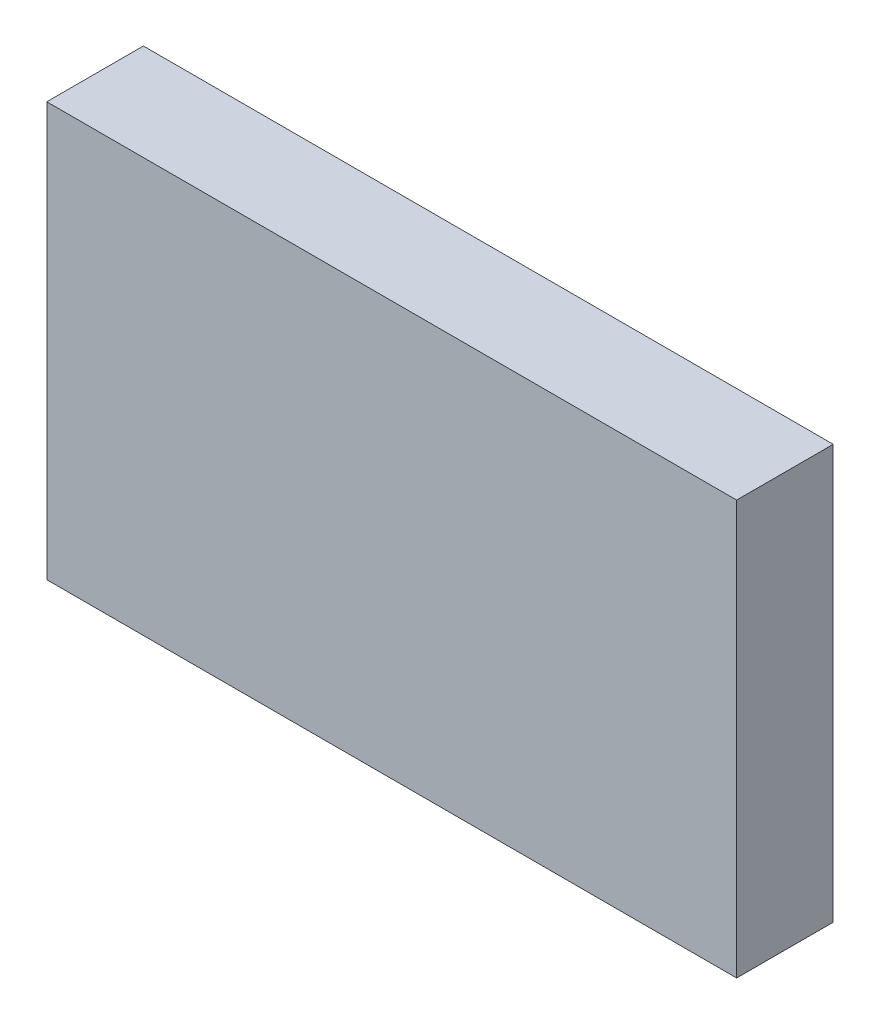
ISO-10303-21;
HEADER;
FILE_DESCRIPTION(('STEP AP214'),'2;1');
FILE_NAME('part.step','',(''),(''),'','','');
FILE_SCHEMA(('AUTOMOTIVE_DESIGN { 1 0 10303 214 1 1 1 1 }'));
ENDSEC;
DATA;
#1=APPLICATION_CONTEXT('core data for automotive mechanical design processes');
#2=APPLICATION_PROTOCOL_DEFINITION('international standard','automotive_design',2000,#1);
#3=PRODUCT_CONTEXT('',#1,'mechanical');
#4=PRODUCT('Part','Part','',(#3));
#5=PRODUCT_RELATED_PRODUCT_CATEGORY('part','',(#4));
#6=PRODUCT_DEFINITION_FORMATION('','',#4);
#7=PRODUCT_DEFINITION_CONTEXT('part definition',#1,'design');
#8=PRODUCT_DEFINITION('design','',#6,#7);
#9=PRODUCT_DEFINITION_SHAPE('','',#8);
#10=(LENGTH_UNIT() NAMED_UNIT(*) SI_UNIT(.MILLI.,.METRE.));
#11=(NAMED_UNIT(*) PLANE_ANGLE_UNIT() SI_UNIT($,.RADIAN.));
#12=(NAMED_UNIT(*) SI_UNIT($,.STERADIAN.) SOLID_ANGLE_UNIT());
#13=UNCERTAINTY_MEASURE_WITH_UNIT(LENGTH_MEASURE(1.E-05),#10,'distance_accuracy_value','');
#14=(GEOMETRIC_REPRESENTATION_CONTEXT(3) GLOBAL_UNCERTAINTY_ASSIGNED_CONTEXT((#13)) GLOBAL_UNIT_ASSIGNED_CONTEXT((#10,
#11,#12)) REPRESENTATION_CONTEXT('',''));
#15=CARTESIAN_POINT('',(0.,0.,0.));
#16=DIRECTION('',(0.,0.,1.));
#17=DIRECTION('',(1.,0.,0.));
#18=AXIS2_PLACEMENT_3D('',#15,#16,#17);
#19=CARTESIAN_POINT('',(25.,15.,3.5));
#20=DIRECTION('',(-1.,0.,0.));
#21=DIRECTION('',(0.,-1.,0.));
#22=AXIS2_PLACEMENT_3D('',#19,#20,#21);
#23=PLANE('',#22);
#24=DIRECTION('',(0.,1.,0.));
#25=VECTOR('',#24,1.);
#26=CARTESIAN_POINT('',(25.,15.,-3.5));
#27=LINE('',#26,#25);
#28=CARTESIAN_POINT('',(25.,-15.,-3.5));
#29=VERTEX_POINT('',#28);
#30=CARTESIAN_POINT('',(25.,15.,-3.5));
#31=VERTEX_POINT('',#30);
#32=EDGE_CURVE('E96',#29,#31,#27,.T.);
#33=ORIENTED_EDGE('',*,*,#32,.T.);
#34=DIRECTION('',(0.,0.,-1.));
#35=VECTOR('',#34,1.);
#36=CARTESIAN_POINT('',(25.,15.,3.5));
#37=LINE('',#36,#35);
#38=CARTESIAN_POINT('',(25.,15.,3.5));
#39=VERTEX_POINT('',#38);
#40=EDGE_CURVE('E11',#39,#31,#37,.T.);
#41=ORIENTED_EDGE('',*,*,#40,.F.);
#42=DIRECTION('',(0.,1.,0.));
#43=VECTOR('',#42,1.);
#44=CARTESIAN_POINT('',(25.,15.,3.5));
#45=LINE('',#44,#43);
#46=CARTESIAN_POINT('',(25.,-15.,3.5));
#47=VERTEX_POINT('',#46);
#48=EDGE_CURVE('E84',#47,#39,#45,.T.);
#49=ORIENTED_EDGE('',*,*,#48,.F.);
#50=DIRECTION('',(0.,0.,-1.));
#51=VECTOR('',#50,1.);
#52=CARTESIAN_POINT('',(25.,-15.,3.5));
#53=LINE('',#52,#51);
#54=EDGE_CURVE('E92',#47,#29,#53,.T.);
#55=ORIENTED_EDGE('',*,*,#54,.T.);
#56=EDGE_LOOP('',(#33,#41,#49,#55));
#57=FACE_BOUND('',#56,.T.);
#58=ADVANCED_FACE('F33',(#57),#23,.F.);
#59=CARTESIAN_POINT('',(-25.,15.,3.5));
#60=DIRECTION('',(0.,-1.,0.));
#61=DIRECTION('',(0.,0.,-1.));
#62=AXIS2_PLACEMENT_3D('',#59,#60,#61);
#63=PLANE('',#62);
#64=DIRECTION('',(-1.,0.,0.));
#65=VECTOR('',#64,1.);
#66=CARTESIAN_POINT('',(-25.,15.,-3.5));
#67=LINE('',#66,#65);
#68=CARTESIAN_POINT('',(-25.,15.,-3.5));
#69=VERTEX_POINT('',#68);
#70=EDGE_CURVE('E88',#31,#69,#67,.T.);
#71=ORIENTED_EDGE('',*,*,#70,.T.);
#72=DIRECTION('',(0.,0.,-1.));
#73=VECTOR('',#72,1.);
#74=CARTESIAN_POINT('',(-25.,15.,3.5));
#75=LINE('',#74,#73);
#76=CARTESIAN_POINT('',(-25.,15.,3.5));
#77=VERTEX_POINT('',#76);
#78=EDGE_CURVE('E41',#77,#69,#75,.T.);
#79=ORIENTED_EDGE('',*,*,#78,.F.);
#80=DIRECTION('',(-1.,0.,0.));
#81=VECTOR('',#80,1.);
#82=CARTESIAN_POINT('',(-25.,15.,3.5));
#83=LINE('',#82,#81);
#84=EDGE_CURVE('E79',#39,#77,#83,.T.);
#85=ORIENTED_EDGE('',*,*,#84,.F.);
#86=ORIENTED_EDGE('',*,*,#40,.T.);
#87=EDGE_LOOP('',(#71,#79,#85,#86));
#88=FACE_BOUND('',#87,.T.);
#89=ADVANCED_FACE('F87',(#88),#63,.F.);
#90=CARTESIAN_POINT('',(-25.,15.,3.5));
#91=DIRECTION('',(1.,0.,0.));
#92=DIRECTION('',(0.,1.,0.));
#93=AXIS2_PLACEMENT_3D('',#90,#91,#92);
#94=PLANE('',#93);
#95=DIRECTION('',(0.,-1.,0.));
#96=VECTOR('',#95,1.);
#97=CARTESIAN_POINT('',(-25.,15.,-3.5));
#98=LINE('',#97,#96);
#99=CARTESIAN_POINT('',(-25.,-15.,-3.5));
#100=VERTEX_POINT('',#99);
#101=EDGE_CURVE('E66',#69,#100,#98,.T.);
#102=ORIENTED_EDGE('',*,*,#101,.T.);
#103=DIRECTION('',(0.,0.,-1.));
#104=VECTOR('',#103,1.);
#105=CARTESIAN_POINT('',(-25.,-15.,3.5));
#106=LINE('',#105,#104);
#107=CARTESIAN_POINT('',(-25.,-15.,3.5));
#108=VERTEX_POINT('',#107);
#109=EDGE_CURVE('E89',#108,#100,#106,.T.);
#110=ORIENTED_EDGE('',*,*,#109,.F.);
#111=DIRECTION('',(0.,-1.,0.));
#112=VECTOR('',#111,1.);
#113=CARTESIAN_POINT('',(-25.,15.,3.5));
#114=LINE('',#113,#112);
#115=EDGE_CURVE('E82',#77,#108,#114,.T.);
#116=ORIENTED_EDGE('',*,*,#115,.F.);
#117=ORIENTED_EDGE('',*,*,#78,.T.);
#118=EDGE_LOOP('',(#102,#110,#116,#117));
#119=FACE_BOUND('',#118,.T.);
#120=ADVANCED_FACE('F90',(#119),#94,.F.);
#121=CARTESIAN_POINT('',(-25.,-15.,3.5));
#122=DIRECTION('',(0.,1.,0.));
#123=DIRECTION('',(0.,0.,1.));
#124=AXIS2_PLACEMENT_3D('',#121,#122,#123);
#125=PLANE('',#124);
#126=DIRECTION('',(1.,0.,0.));
#127=VECTOR('',#126,1.);
#128=CARTESIAN_POINT('',(-25.,-15.,-3.5));
#129=LINE('',#128,#127);
#130=EDGE_CURVE('E72',#100,#29,#129,.T.);
#131=ORIENTED_EDGE('',*,*,#130,.T.);
#132=ORIENTED_EDGE('',*,*,#54,.F.);
#133=DIRECTION('',(1.,0.,0.));
#134=VECTOR('',#133,1.);
#135=CARTESIAN_POINT('',(-25.,-15.,3.5));
#136=LINE('',#135,#134);
#137=EDGE_CURVE('E49',#108,#47,#136,.T.);
#138=ORIENTED_EDGE('',*,*,#137,.F.);
#139=ORIENTED_EDGE('',*,*,#109,.T.);
#140=EDGE_LOOP('',(#131,#132,#138,#139));
#141=FACE_BOUND('',#140,.T.);
#142=ADVANCED_FACE('F103',(#141),#125,.F.);
#143=CARTESIAN_POINT('',(0.,0.,3.5));
#144=DIRECTION('',(0.,0.,1.));
#145=DIRECTION('',(1.,0.,0.));
#146=AXIS2_PLACEMENT_3D('',#143,#144,#145);
#147=PLANE('',#146);
#148=ORIENTED_EDGE('',*,*,#48,.T.);
#149=ORIENTED_EDGE('',*,*,#84,.T.);
#150=ORIENTED_EDGE('',*,*,#115,.T.);
#151=ORIENTED_EDGE('',*,*,#137,.T.);
#152=EDGE_LOOP('',(#148,#149,#150,#151));
#153=FACE_BOUND('',#152,.T.);
#154=ADVANCED_FACE('F80',(#153),#147,.T.);
#155=CARTESIAN_POINT('',(0.,0.,-3.5));
#156=DIRECTION('',(0.,0.,1.));
#157=DIRECTION('',(1.,0.,0.));
#158=AXIS2_PLACEMENT_3D('',#155,#156,#157);
#159=PLANE('',#158);
#160=ORIENTED_EDGE('',*,*,#32,.F.);
#161=ORIENTED_EDGE('',*,*,#130,.F.);
#162=ORIENTED_EDGE('',*,*,#101,.F.);
#163=ORIENTED_EDGE('',*,*,#70,.F.);
#164=EDGE_LOOP('',(#160,#161,#162,#163));
#165=FACE_BOUND('',#164,.T.);
#166=ADVANCED_FACE('F106',(#165),#159,.F.);
#167=CLOSED_SHELL('',(#58,#89,#120,#142,#154,#166));
#168=MANIFOLD_SOLID_BREP('B2',#167);
#169=ADVANCED_BREP_SHAPE_REPRESENTATION('',(#18,#168),#14);
#170=SHAPE_DEFINITION_REPRESENTATION(#9,#169);
ENDSEC;
END-ISO-10303-21;
